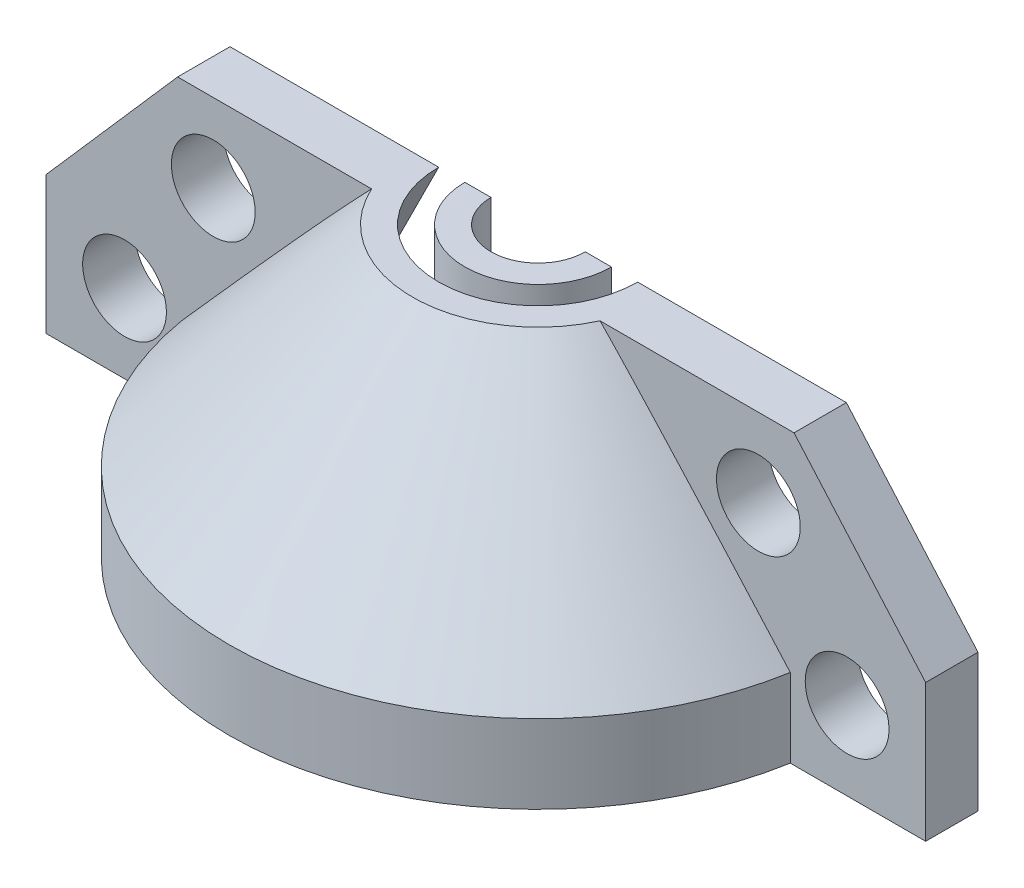
ISO-10303-21;
HEADER;
FILE_DESCRIPTION(('STEP AP214'),'2;1');
FILE_NAME('part.step','',(''),(''),'','','');
FILE_SCHEMA(('AUTOMOTIVE_DESIGN { 1 0 10303 214 1 1 1 1 }'));
ENDSEC;
DATA;
#1=APPLICATION_CONTEXT('core data for automotive mechanical design processes');
#2=APPLICATION_PROTOCOL_DEFINITION('international standard','automotive_design',2000,#1);
#3=PRODUCT_CONTEXT('',#1,'mechanical');
#4=PRODUCT('Part','Part','',(#3));
#5=PRODUCT_RELATED_PRODUCT_CATEGORY('part','',(#4));
#6=PRODUCT_DEFINITION_FORMATION('','',#4);
#7=PRODUCT_DEFINITION_CONTEXT('part definition',#1,'design');
#8=PRODUCT_DEFINITION('design','',#6,#7);
#9=PRODUCT_DEFINITION_SHAPE('','',#8);
#10=(LENGTH_UNIT() NAMED_UNIT(*) SI_UNIT(.MILLI.,.METRE.));
#11=(NAMED_UNIT(*) PLANE_ANGLE_UNIT() SI_UNIT($,.RADIAN.));
#12=(NAMED_UNIT(*) SI_UNIT($,.STERADIAN.) SOLID_ANGLE_UNIT());
#13=UNCERTAINTY_MEASURE_WITH_UNIT(LENGTH_MEASURE(1.E-05),#10,'distance_accuracy_value','');
#14=(GEOMETRIC_REPRESENTATION_CONTEXT(3) GLOBAL_UNCERTAINTY_ASSIGNED_CONTEXT((#13)) GLOBAL_UNIT_ASSIGNED_CONTEXT((#10,
#11,#12)) REPRESENTATION_CONTEXT('',''));
#15=CARTESIAN_POINT('',(0.,0.,0.));
#16=DIRECTION('',(0.,0.,1.));
#17=DIRECTION('',(1.,0.,0.));
#18=AXIS2_PLACEMENT_3D('',#15,#16,#17);
#19=CARTESIAN_POINT('',(0.,8.,0.));
#20=DIRECTION('',(0.,-1.,0.));
#21=DIRECTION('',(0.,0.,-1.));
#22=AXIS2_PLACEMENT_3D('',#19,#20,#21);
#23=CONICAL_SURFACE('',#22,4.8,0.718829999621625);
#24=CARTESIAN_POINT('',(-11.6298948995748,-0.000700000000000867,2.00000000000008));
#25=CARTESIAN_POINT('',(-11.277929965793,0.395697502474147,2.00000000000008));
#26=CARTESIAN_POINT('',(-10.9257350982388,0.791891602100132,2.00000000000008));
#27=CARTESIAN_POINT('',(-10.2205029104058,1.58384445320884,2.00000000000007));
#28=CARTESIAN_POINT('',(-9.86746528564968,1.979602933503,2.00000000000007));
#29=CARTESIAN_POINT('',(-9.15706021327963,2.77412515869561,2.00000000000006));
#30=CARTESIAN_POINT('',(-8.79968389750383,3.17288097791746,2.00000000000006));
#31=CARTESIAN_POINT('',(-8.08377041092578,3.96903655979642,2.00000000000006));
#32=CARTESIAN_POINT('',(-7.72523381345148,4.36643683738495,2.00000000000005));
#33=CARTESIAN_POINT('',(-7.14527112689657,5.00608453080283,2.00000000000005));
#34=CARTESIAN_POINT('',(-6.92445562800649,5.24888534265698,2.00000000000005));
#35=CARTESIAN_POINT('',(-6.48185524832197,5.73360128217455,2.00000000000005));
#36=CARTESIAN_POINT('',(-6.26007037001876,5.97551641211118,2.00000000000004));
#37=CARTESIAN_POINT('',(-5.81487570516459,6.45850323675924,2.00000000000004));
#38=CARTESIAN_POINT('',(-5.59146401680588,6.69957318089972,2.00000000000004));
#39=CARTESIAN_POINT('',(-5.14286133300625,7.17999204616012,2.00000000000004));
#40=CARTESIAN_POINT('',(-4.91767058421294,7.41934119735678,2.00000000000003));
#41=CARTESIAN_POINT('',(-4.46619117208702,7.8939998968516,2.00000000000003));
#42=CARTESIAN_POINT('',(-4.23991968350977,8.12932570601176,2.00000000000003));
#43=CARTESIAN_POINT('',(-3.89751897932808,8.47951770727801,2.00000000000003));
#44=CARTESIAN_POINT('',(-3.78285394206366,8.59581445793893,2.00000000000003));
#45=CARTESIAN_POINT('',(-3.55228205662546,8.82716612797727,2.00000000000002));
#46=CARTESIAN_POINT('',(-3.43637524478234,8.94222108348932,2.00000000000002));
#47=CARTESIAN_POINT('',(-3.20326572125683,9.17041817407442,2.00000000000002));
#48=CARTESIAN_POINT('',(-3.0860670447052,9.28356442243404,2.00000000000002));
#49=CARTESIAN_POINT('',(-2.84960317198888,9.50767456631936,2.00000000000002));
#50=CARTESIAN_POINT('',(-2.73033807966325,9.61863857090975,2.00000000000002));
#51=CARTESIAN_POINT('',(-2.48914480496235,9.83742872260659,2.00000000000002));
#52=CARTESIAN_POINT('',(-2.36721903299812,9.94525751899503,2.00000000000002));
#53=CARTESIAN_POINT('',(-2.11961388419542,10.1564996760355,2.00000000000001));
#54=CARTESIAN_POINT('',(-1.99393575561795,10.2599144778391,2.00000000000001));
#55=CARTESIAN_POINT('',(-1.83022649835787,10.387523291099,2.00000000000001));
#56=CARTESIAN_POINT('',(-1.79463476881164,10.414851865276,2.00000000000001));
#57=CARTESIAN_POINT('',(-1.72299938913156,10.4689177213633,2.00000000000001));
#58=CARTESIAN_POINT('',(-1.6869556997414,10.4956549513454,2.00000000000001));
#59=CARTESIAN_POINT('',(-1.6143694408097,10.5484590342689,2.00000000000001));
#60=CARTESIAN_POINT('',(-1.57782678480733,10.5745257687112,2.00000000000001));
#61=CARTESIAN_POINT('',(-1.50420085791037,10.6258822355557,2.00000000000001));
#62=CARTESIAN_POINT('',(-1.46711758227002,10.651171961131,2.00000000000001));
#63=CARTESIAN_POINT('',(-1.35520211222561,10.7255575318971,2.00000000000001));
#64=CARTESIAN_POINT('',(-1.27947724454202,10.7733367556806,2.00000000000001));
#65=CARTESIAN_POINT('',(-1.12526540004645,10.8641451205038,2.00000000000001));
#66=CARTESIAN_POINT('',(-1.04677920962335,10.9071755997127,2.00000000000001));
#67=CARTESIAN_POINT('',(-0.856345213035441,11.0018796083495,2.00000000000001));
#68=CARTESIAN_POINT('',(-0.742907806025315,11.0507232497878,2.00000000000001));
#69=CARTESIAN_POINT('',(-0.568392945044191,11.110325775848,2.));
#70=CARTESIAN_POINT('',(-0.509633290539307,11.1278915978731,2.));
#71=CARTESIAN_POINT('',(-0.390794586876089,11.1577153223655,2.));
#72=CARTESIAN_POINT('',(-0.330716537070085,11.1699771085995,2.));
#73=CARTESIAN_POINT('',(-0.2254718633146,11.1860773602293,2.));
#74=CARTESIAN_POINT('',(-0.180512084535044,11.1912797807709,2.));
#75=CARTESIAN_POINT('',(-0.0901405901280818,11.198267501285,2.));
#76=CARTESIAN_POINT('',(-0.044727771281173,11.2000384413739,2.));
#77=CARTESIAN_POINT('',(0.000700000000006584,11.1999998600001,2.));
#78=B_SPLINE_CURVE_WITH_KNOTS('',3,(#24,#25,#26,#27,#28,#29,#30,#31,#32,#33,#34,#35,#36,#37,#38,
#39,#40,#41,#42,#43,#44,#45,#46,#47,#48,#49,#50,#51,#52,#53,#54,#55,#56,#57,#58,#59,#60,#61,#62,
#63,#64,#65,#66,#67,#68,#69,#70,#71,#72,#73,#74,#75,#76,#77),.UNSPECIFIED.,.F.,.F.,(4,2,2,2,2,2,
2,2,2,2,2,2,2,2,2,2,2,2,2,2,2,2,2,2,2,2,4),(0.,1.59031291082024,3.18133149597243,
4.78772826180175,6.3934254467404,7.37800742947405,8.36258688339118,9.34860603918943,
10.3344908125966,11.313839919616,11.803789187946,12.2937241607454,12.7824158008658,
13.2710829546514,13.7593244146268,14.2474052269082,14.3820205195533,14.5166475867332,
14.6512982858161,14.7859501676302,15.0544091042225,15.3227921964053,15.6920442912289,
15.8758369692546,16.0594948402742,16.1951494298162,16.3313704840475),.UNSPECIFIED.);
#79=CARTESIAN_POINT('',(-11.6292734080853,0.,2.00000000000008));
#80=VERTEX_POINT('',#79);
#81=CARTESIAN_POINT('',(-4.36348484585427,8.,2.00000000000003));
#82=VERTEX_POINT('',#81);
#83=EDGE_CURVE('E61',#80,#82,#78,.T.);
#84=ORIENTED_EDGE('',*,*,#83,.F.);
#85=CARTESIAN_POINT('',(0.,0.,0.));
#86=DIRECTION('',(0.,1.,0.));
#87=DIRECTION('',(0.,0.,1.));
#88=AXIS2_PLACEMENT_3D('',#85,#86,#87);
#89=CIRCLE('',#88,11.8);
#90=CARTESIAN_POINT('',(11.6292734080853,0.,1.99999999999992));
#91=VERTEX_POINT('',#90);
#92=EDGE_CURVE('E284',#80,#91,#89,.T.);
#93=ORIENTED_EDGE('',*,*,#92,.T.);
#94=CARTESIAN_POINT('',(11.6298948995748,-0.000700000000000867,1.99999999999992));
#95=CARTESIAN_POINT('',(11.277929965793,0.395697502474146,1.99999999999992));
#96=CARTESIAN_POINT('',(10.9257350982388,0.791891602100133,1.99999999999992));
#97=CARTESIAN_POINT('',(10.2205029104058,1.58384445320884,1.99999999999993));
#98=CARTESIAN_POINT('',(9.86746528564971,1.97960293350301,1.99999999999993));
#99=CARTESIAN_POINT('',(9.15706021327965,2.77412515869562,1.99999999999994));
#100=CARTESIAN_POINT('',(8.79968389750385,3.17288097791747,1.99999999999994));
#101=CARTESIAN_POINT('',(8.0837704109258,3.96903655979643,1.99999999999994));
#102=CARTESIAN_POINT('',(7.7252338134515,4.36643683738496,1.99999999999995));
#103=CARTESIAN_POINT('',(7.14527112689658,5.00608453080284,1.99999999999995));
#104=CARTESIAN_POINT('',(6.9244556280065,5.24888534265699,1.99999999999995));
#105=CARTESIAN_POINT('',(6.48185524832199,5.73360128217457,1.99999999999995));
#106=CARTESIAN_POINT('',(6.26007037001878,5.97551641211119,1.99999999999996));
#107=CARTESIAN_POINT('',(5.81487570516461,6.45850323675925,1.99999999999996));
#108=CARTESIAN_POINT('',(5.5914640168059,6.69957318089973,1.99999999999996));
#109=CARTESIAN_POINT('',(5.14286133300628,7.17999204616013,1.99999999999996));
#110=CARTESIAN_POINT('',(4.91767058421296,7.41934119735678,1.99999999999997));
#111=CARTESIAN_POINT('',(4.46619117208705,7.8939998968516,1.99999999999997));
#112=CARTESIAN_POINT('',(4.2399196835098,8.12932570601177,1.99999999999997));
#113=CARTESIAN_POINT('',(3.89751897932811,8.47951770727802,1.99999999999997));
#114=CARTESIAN_POINT('',(3.78285394206368,8.59581445793893,1.99999999999997));
#115=CARTESIAN_POINT('',(3.55228205662548,8.82716612797728,1.99999999999998));
#116=CARTESIAN_POINT('',(3.43637524478236,8.94222108348932,1.99999999999998));
#117=CARTESIAN_POINT('',(3.20326572125686,9.17041817407442,1.99999999999998));
#118=CARTESIAN_POINT('',(3.08606704470523,9.28356442243404,1.99999999999998));
#119=CARTESIAN_POINT('',(2.8496031719889,9.50767456631936,1.99999999999998));
#120=CARTESIAN_POINT('',(2.73033807966328,9.61863857090975,1.99999999999998));
#121=CARTESIAN_POINT('',(2.48914480496238,9.83742872260659,1.99999999999998));
#122=CARTESIAN_POINT('',(2.36721903299814,9.94525751899503,1.99999999999998));
#123=CARTESIAN_POINT('',(2.11961388419544,10.1564996760355,1.99999999999999));
#124=CARTESIAN_POINT('',(1.99393575561798,10.2599144778391,1.99999999999999));
#125=CARTESIAN_POINT('',(1.8302264983579,10.387523291099,1.99999999999999));
#126=CARTESIAN_POINT('',(1.79463476881167,10.414851865276,1.99999999999999));
#127=CARTESIAN_POINT('',(1.72299938913159,10.4689177213633,1.99999999999999));
#128=CARTESIAN_POINT('',(1.68695569974143,10.4956549513454,1.99999999999999));
#129=CARTESIAN_POINT('',(1.61436944080973,10.5484590342689,1.99999999999999));
#130=CARTESIAN_POINT('',(1.57782678480735,10.5745257687112,1.99999999999999));
#131=CARTESIAN_POINT('',(1.5042008579104,10.6258822355557,1.99999999999999));
#132=CARTESIAN_POINT('',(1.46711758227005,10.651171961131,1.99999999999999));
#133=CARTESIAN_POINT('',(1.35520211222564,10.7255575318971,1.99999999999999));
#134=CARTESIAN_POINT('',(1.27947724454205,10.7733367556806,1.99999999999999));
#135=CARTESIAN_POINT('',(1.12526540004648,10.8641451205038,1.99999999999999));
#136=CARTESIAN_POINT('',(1.04677920962337,10.9071755997127,1.99999999999999));
#137=CARTESIAN_POINT('',(0.856345213035467,11.0018796083495,1.99999999999999));
#138=CARTESIAN_POINT('',(0.742907806025343,11.0507232497878,1.99999999999999));
#139=CARTESIAN_POINT('',(0.568392945044219,11.110325775848,2.));
#140=CARTESIAN_POINT('',(0.509633290539336,11.1278915978731,2.));
#141=CARTESIAN_POINT('',(0.390794586876119,11.1577153223655,2.));
#142=CARTESIAN_POINT('',(0.330716537070114,11.1699771085995,2.));
#143=CARTESIAN_POINT('',(0.225471863314628,11.1860773602293,2.));
#144=CARTESIAN_POINT('',(0.180512084535073,11.1912797807709,2.));
#145=CARTESIAN_POINT('',(0.0901405901281099,11.198267501285,2.));
#146=CARTESIAN_POINT('',(0.0447277712812011,11.2000384413739,2.));
#147=CARTESIAN_POINT('',(-0.00069999999997856,11.1999998600001,2.));
#148=B_SPLINE_CURVE_WITH_KNOTS('',3,(#94,#95,#96,#97,#98,#99,#100,#101,#102,#103,#104,#105,#106,
#107,#108,#109,#110,#111,#112,#113,#114,#115,#116,#117,#118,#119,#120,#121,#122,#123,#124,#125,
#126,#127,#128,#129,#130,#131,#132,#133,#134,#135,#136,#137,#138,#139,#140,#141,#142,#143,#144,
#145,#146,#147),.UNSPECIFIED.,.F.,.F.,(4,2,2,2,2,2,2,2,2,2,2,2,2,2,2,2,2,2,2,2,2,2,2,2,2,2,4),
(0.,1.59031291082024,3.18133149597243,4.78772826180176,6.39342544674042,7.37800742947407,
8.36258688339119,9.34860603918944,10.3344908125966,11.313839919616,11.803789187946,
12.2937241607454,12.7824158008658,13.2710829546514,13.7593244146268,14.2474052269082,
14.3820205195533,14.5166475867332,14.6512982858161,14.7859501676302,15.0544091042225,
15.3227921964053,15.6920442912289,15.8758369692546,16.0594948402742,16.1951494298162,
16.3313704840475),.UNSPECIFIED.);
#149=CARTESIAN_POINT('',(4.3634848458543,8.,1.99999999999997));
#150=VERTEX_POINT('',#149);
#151=EDGE_CURVE('E268',#91,#150,#148,.T.);
#152=ORIENTED_EDGE('',*,*,#151,.T.);
#153=CARTESIAN_POINT('',(0.,8.,0.));
#154=DIRECTION('',(0.,1.,0.));
#155=DIRECTION('',(0.,0.,1.));
#156=AXIS2_PLACEMENT_3D('',#153,#154,#155);
#157=CIRCLE('',#156,4.8);
#158=EDGE_CURVE('E287',#82,#150,#157,.T.);
#159=ORIENTED_EDGE('',*,*,#158,.F.);
#160=EDGE_LOOP('',(#84,#93,#152,#159));
#161=FACE_BOUND('',#160,.T.);
#162=ADVANCED_FACE('F45',(#161),#23,.T.);
#163=CARTESIAN_POINT('',(0.,0.,0.));
#164=DIRECTION('',(0.,1.,0.));
#165=DIRECTION('',(0.,0.,1.));
#166=AXIS2_PLACEMENT_3D('',#163,#164,#165);
#167=CYLINDRICAL_SURFACE('',#166,11.8);
#168=DIRECTION('',(0.,1.,0.));
#169=VECTOR('',#168,1.);
#170=CARTESIAN_POINT('',(-11.6292734080853,0.,2.00000000000008));
#171=LINE('',#170,#169);
#172=CARTESIAN_POINT('',(-11.6292734080853,-3.,2.00000000000008));
#173=VERTEX_POINT('',#172);
#174=EDGE_CURVE('E68',#173,#80,#171,.T.);
#175=ORIENTED_EDGE('',*,*,#174,.F.);
#176=CARTESIAN_POINT('',(0.,-3.,0.));
#177=DIRECTION('',(0.,1.,0.));
#178=DIRECTION('',(0.,0.,1.));
#179=AXIS2_PLACEMENT_3D('',#176,#177,#178);
#180=CIRCLE('',#179,11.8);
#181=CARTESIAN_POINT('',(11.6292734080853,-3.,1.99999999999992));
#182=VERTEX_POINT('',#181);
#183=EDGE_CURVE('E165',#173,#182,#180,.T.);
#184=ORIENTED_EDGE('',*,*,#183,.T.);
#185=DIRECTION('',(0.,1.,0.));
#186=VECTOR('',#185,1.);
#187=CARTESIAN_POINT('',(11.6292734080853,0.,1.99999999999992));
#188=LINE('',#187,#186);
#189=EDGE_CURVE('E11',#182,#91,#188,.T.);
#190=ORIENTED_EDGE('',*,*,#189,.T.);
#191=ORIENTED_EDGE('',*,*,#92,.F.);
#192=EDGE_LOOP('',(#175,#184,#190,#191));
#193=FACE_BOUND('',#192,.T.);
#194=ADVANCED_FACE('F432',(#193),#167,.T.);
#195=CARTESIAN_POINT('',(0.,-3.,0.));
#196=DIRECTION('',(0.,1.,0.));
#197=DIRECTION('',(0.,0.,1.));
#198=AXIS2_PLACEMENT_3D('',#195,#196,#197);
#199=PLANE('',#198);
#200=DIRECTION('',(1.,0.,0.));
#201=VECTOR('',#200,1.);
#202=CARTESIAN_POINT('',(0.,-3.,0.));
#203=LINE('',#202,#201);
#204=CARTESIAN_POINT('',(-16.8,-3.,1.17313772985129E-13));
#205=VERTEX_POINT('',#204);
#206=CARTESIAN_POINT('',(-1.8,-3.,0.));
#207=VERTEX_POINT('',#206);
#208=EDGE_CURVE('E290',#205,#207,#203,.T.);
#209=ORIENTED_EDGE('',*,*,#208,.T.);
#210=CARTESIAN_POINT('',(0.,-3.,0.));
#211=DIRECTION('',(0.,-1.,0.));
#212=DIRECTION('',(0.,0.,-1.));
#213=AXIS2_PLACEMENT_3D('',#210,#211,#212);
#214=CIRCLE('',#213,1.8);
#215=CARTESIAN_POINT('',(1.8,-3.,0.));
#216=VERTEX_POINT('',#215);
#217=EDGE_CURVE('E54',#216,#207,#214,.T.);
#218=ORIENTED_EDGE('',*,*,#217,.F.);
#219=DIRECTION('',(-1.,0.,0.));
#220=VECTOR('',#219,1.);
#221=CARTESIAN_POINT('',(0.,-3.,0.));
#222=LINE('',#221,#220);
#223=CARTESIAN_POINT('',(16.8,-3.,-1.17313772985129E-13));
#224=VERTEX_POINT('',#223);
#225=EDGE_CURVE('E311',#224,#216,#222,.T.);
#226=ORIENTED_EDGE('',*,*,#225,.F.);
#227=DIRECTION('',(0.,0.,-1.));
#228=VECTOR('',#227,1.);
#229=CARTESIAN_POINT('',(16.8,-3.,1.99999999999988));
#230=LINE('',#229,#228);
#231=CARTESIAN_POINT('',(16.8,-3.,1.99999999999988));
#232=VERTEX_POINT('',#231);
#233=EDGE_CURVE('E277',#232,#224,#230,.T.);
#234=ORIENTED_EDGE('',*,*,#233,.F.);
#235=DIRECTION('',(-1.,0.,0.));
#236=VECTOR('',#235,1.);
#237=CARTESIAN_POINT('',(10.8,-3.,1.99999999999992));
#238=LINE('',#237,#236);
#239=EDGE_CURVE('E390',#232,#182,#238,.T.);
#240=ORIENTED_EDGE('',*,*,#239,.T.);
#241=ORIENTED_EDGE('',*,*,#183,.F.);
#242=DIRECTION('',(-1.,0.,0.));
#243=VECTOR('',#242,1.);
#244=CARTESIAN_POINT('',(-10.8,-3.,2.00000000000008));
#245=LINE('',#244,#243);
#246=CARTESIAN_POINT('',(-16.8,-3.,2.00000000000012));
#247=VERTEX_POINT('',#246);
#248=EDGE_CURVE('E185',#173,#247,#245,.T.);
#249=ORIENTED_EDGE('',*,*,#248,.T.);
#250=DIRECTION('',(0.,0.,-1.));
#251=VECTOR('',#250,1.);
#252=CARTESIAN_POINT('',(-16.8,-3.,2.00000000000012));
#253=LINE('',#252,#251);
#254=EDGE_CURVE('E198',#247,#205,#253,.T.);
#255=ORIENTED_EDGE('',*,*,#254,.T.);
#256=EDGE_LOOP('',(#209,#218,#226,#234,#240,#241,#249,#255));
#257=FACE_BOUND('',#256,.T.);
#258=ADVANCED_FACE('F47',(#257),#199,.F.);
#259=CARTESIAN_POINT('',(0.,0.,0.));
#260=DIRECTION('',(0.,-1.,0.));
#261=DIRECTION('',(0.,0.,-1.));
#262=AXIS2_PLACEMENT_3D('',#259,#260,#261);
#263=CYLINDRICAL_SURFACE('',#262,1.8);
#264=CARTESIAN_POINT('',(0.,8.,0.));
#265=DIRECTION('',(0.,-1.,0.));
#266=DIRECTION('',(0.,0.,-1.));
#267=AXIS2_PLACEMENT_3D('',#264,#265,#266);
#268=CIRCLE('',#267,1.8);
#269=CARTESIAN_POINT('',(1.8,8.,0.));
#270=VERTEX_POINT('',#269);
#271=CARTESIAN_POINT('',(-1.8,8.,0.));
#272=VERTEX_POINT('',#271);
#273=EDGE_CURVE('E345',#270,#272,#268,.T.);
#274=ORIENTED_EDGE('',*,*,#273,.F.);
#275=DIRECTION('',(0.,-1.,0.));
#276=VECTOR('',#275,1.);
#277=CARTESIAN_POINT('',(1.8,0.,0.));
#278=LINE('',#277,#276);
#279=EDGE_CURVE('E314',#270,#216,#278,.T.);
#280=ORIENTED_EDGE('',*,*,#279,.T.);
#281=ORIENTED_EDGE('',*,*,#217,.T.);
#282=DIRECTION('',(0.,-1.,0.));
#283=VECTOR('',#282,1.);
#284=CARTESIAN_POINT('',(-1.8,0.,0.));
#285=LINE('',#284,#283);
#286=EDGE_CURVE('E293',#272,#207,#285,.T.);
#287=ORIENTED_EDGE('',*,*,#286,.F.);
#288=EDGE_LOOP('',(#274,#280,#281,#287));
#289=FACE_BOUND('',#288,.T.);
#290=ADVANCED_FACE('F352',(#289),#263,.F.);
#291=CARTESIAN_POINT('',(0.,8.,0.));
#292=DIRECTION('',(0.,-1.,0.));
#293=DIRECTION('',(0.,0.,-1.));
#294=AXIS2_PLACEMENT_3D('',#291,#292,#293);
#295=PLANE('',#294);
#296=CARTESIAN_POINT('',(0.,8.,0.));
#297=DIRECTION('',(0.,-1.,0.));
#298=DIRECTION('',(0.,0.,-1.));
#299=AXIS2_PLACEMENT_3D('',#296,#297,#298);
#300=CIRCLE('',#299,2.8);
#301=CARTESIAN_POINT('',(2.8,8.,0.));
#302=VERTEX_POINT('',#301);
#303=CARTESIAN_POINT('',(-2.8,8.,0.));
#304=VERTEX_POINT('',#303);
#305=EDGE_CURVE('E342',#302,#304,#300,.T.);
#306=ORIENTED_EDGE('',*,*,#305,.F.);
#307=DIRECTION('',(1.,0.,0.));
#308=VECTOR('',#307,1.);
#309=CARTESIAN_POINT('',(0.,8.,0.));
#310=LINE('',#309,#308);
#311=EDGE_CURVE('E318',#270,#302,#310,.T.);
#312=ORIENTED_EDGE('',*,*,#311,.F.);
#313=ORIENTED_EDGE('',*,*,#273,.T.);
#314=DIRECTION('',(-1.,0.,0.));
#315=VECTOR('',#314,1.);
#316=CARTESIAN_POINT('',(0.,8.,0.));
#317=LINE('',#316,#315);
#318=EDGE_CURVE('E296',#272,#304,#317,.T.);
#319=ORIENTED_EDGE('',*,*,#318,.T.);
#320=EDGE_LOOP('',(#306,#312,#313,#319));
#321=FACE_BOUND('',#320,.T.);
#322=ADVANCED_FACE('F360',(#321),#295,.F.);
#323=CARTESIAN_POINT('',(0.,0.,0.));
#324=DIRECTION('',(0.,-1.,0.));
#325=DIRECTION('',(0.,0.,-1.));
#326=AXIS2_PLACEMENT_3D('',#323,#324,#325);
#327=CYLINDRICAL_SURFACE('',#326,2.8);
#328=CARTESIAN_POINT('',(0.,0.,0.));
#329=DIRECTION('',(0.,-1.,0.));
#330=DIRECTION('',(0.,0.,-1.));
#331=AXIS2_PLACEMENT_3D('',#328,#329,#330);
#332=CIRCLE('',#331,2.8);
#333=CARTESIAN_POINT('',(2.8,0.,0.));
#334=VERTEX_POINT('',#333);
#335=CARTESIAN_POINT('',(-2.8,0.,0.));
#336=VERTEX_POINT('',#335);
#337=EDGE_CURVE('E339',#334,#336,#332,.T.);
#338=ORIENTED_EDGE('',*,*,#337,.F.);
#339=DIRECTION('',(0.,1.,0.));
#340=VECTOR('',#339,1.);
#341=CARTESIAN_POINT('',(2.8,0.,0.));
#342=LINE('',#341,#340);
#343=EDGE_CURVE('E322',#334,#302,#342,.T.);
#344=ORIENTED_EDGE('',*,*,#343,.T.);
#345=ORIENTED_EDGE('',*,*,#305,.T.);
#346=DIRECTION('',(0.,1.,0.));
#347=VECTOR('',#346,1.);
#348=CARTESIAN_POINT('',(-2.8,0.,0.));
#349=LINE('',#348,#347);
#350=EDGE_CURVE('E300',#336,#304,#349,.T.);
#351=ORIENTED_EDGE('',*,*,#350,.F.);
#352=EDGE_LOOP('',(#338,#344,#345,#351));
#353=FACE_BOUND('',#352,.T.);
#354=ADVANCED_FACE('F544',(#353),#327,.T.);
#355=CARTESIAN_POINT('',(0.,0.,0.));
#356=DIRECTION('',(0.,-1.,0.));
#357=DIRECTION('',(0.,0.,-1.));
#358=AXIS2_PLACEMENT_3D('',#355,#356,#357);
#359=PLANE('',#358);
#360=CARTESIAN_POINT('',(0.,0.,0.));
#361=DIRECTION('',(0.,-1.,0.));
#362=DIRECTION('',(0.,0.,-1.));
#363=AXIS2_PLACEMENT_3D('',#360,#361,#362);
#364=CIRCLE('',#363,7.8);
#365=CARTESIAN_POINT('',(7.8,0.,0.));
#366=VERTEX_POINT('',#365);
#367=CARTESIAN_POINT('',(-7.8,0.,0.));
#368=VERTEX_POINT('',#367);
#369=EDGE_CURVE('E336',#366,#368,#364,.T.);
#370=ORIENTED_EDGE('',*,*,#369,.F.);
#371=DIRECTION('',(1.,0.,0.));
#372=VECTOR('',#371,1.);
#373=CARTESIAN_POINT('',(0.,0.,0.));
#374=LINE('',#373,#372);
#375=EDGE_CURVE('E326',#334,#366,#374,.T.);
#376=ORIENTED_EDGE('',*,*,#375,.F.);
#377=ORIENTED_EDGE('',*,*,#337,.T.);
#378=DIRECTION('',(-1.,0.,0.));
#379=VECTOR('',#378,1.);
#380=CARTESIAN_POINT('',(0.,0.,0.));
#381=LINE('',#380,#379);
#382=EDGE_CURVE('E304',#336,#368,#381,.T.);
#383=ORIENTED_EDGE('',*,*,#382,.T.);
#384=EDGE_LOOP('',(#370,#376,#377,#383));
#385=FACE_BOUND('',#384,.T.);
#386=ADVANCED_FACE('F428',(#385),#359,.F.);
#387=CARTESIAN_POINT('',(0.,8.,0.));
#388=DIRECTION('',(0.,-1.,0.));
#389=DIRECTION('',(0.,0.,-1.));
#390=AXIS2_PLACEMENT_3D('',#387,#388,#389);
#391=CONICAL_SURFACE('',#390,3.8,0.463647609000806);
#392=CARTESIAN_POINT('',(0.,8.,0.));
#393=DIRECTION('',(0.,-1.,0.));
#394=DIRECTION('',(0.,0.,-1.));
#395=AXIS2_PLACEMENT_3D('',#392,#393,#394);
#396=CIRCLE('',#395,3.8);
#397=CARTESIAN_POINT('',(3.8,8.,0.));
#398=VERTEX_POINT('',#397);
#399=CARTESIAN_POINT('',(-3.8,8.,0.));
#400=VERTEX_POINT('',#399);
#401=EDGE_CURVE('E159',#398,#400,#396,.T.);
#402=ORIENTED_EDGE('',*,*,#401,.F.);
#403=DIRECTION('',(0.447213595499958,-0.894427190999916,0.));
#404=VECTOR('',#403,1.);
#405=CARTESIAN_POINT('',(6.24,3.12,0.));
#406=LINE('',#405,#404);
#407=EDGE_CURVE('E330',#398,#366,#406,.T.);
#408=ORIENTED_EDGE('',*,*,#407,.T.);
#409=ORIENTED_EDGE('',*,*,#369,.T.);
#410=DIRECTION('',(-0.447213595499958,-0.894427190999916,0.));
#411=VECTOR('',#410,1.);
#412=CARTESIAN_POINT('',(-6.24,3.12,0.));
#413=LINE('',#412,#411);
#414=EDGE_CURVE('E308',#400,#368,#413,.T.);
#415=ORIENTED_EDGE('',*,*,#414,.F.);
#416=EDGE_LOOP('',(#402,#408,#409,#415));
#417=FACE_BOUND('',#416,.T.);
#418=ADVANCED_FACE('F421',(#417),#391,.F.);
#419=CARTESIAN_POINT('',(0.,0.,0.));
#420=DIRECTION('',(0.,0.,-1.));
#421=DIRECTION('',(-1.,0.,0.));
#422=AXIS2_PLACEMENT_3D('',#419,#420,#421);
#423=PLANE('',#422);
#424=ORIENTED_EDGE('',*,*,#407,.F.);
#425=DIRECTION('',(1.,0.,0.));
#426=VECTOR('',#425,1.);
#427=CARTESIAN_POINT('',(3.8,8.,0.));
#428=LINE('',#427,#426);
#429=CARTESIAN_POINT('',(11.772609359551,8.,0.));
#430=VERTEX_POINT('',#429);
#431=EDGE_CURVE('E166',#398,#430,#428,.T.);
#432=ORIENTED_EDGE('',*,*,#431,.T.);
#433=DIRECTION('',(0.658504607868518,-0.752576694706878,0.));
#434=VECTOR('',#433,1.);
#435=CARTESIAN_POINT('',(11.772609359551,8.,0.));
#436=LINE('',#435,#434);
#437=CARTESIAN_POINT('',(16.8,2.25441069662969,-1.17313772985129E-13));
#438=VERTEX_POINT('',#437);
#439=EDGE_CURVE('E386',#430,#438,#436,.T.);
#440=ORIENTED_EDGE('',*,*,#439,.T.);
#441=DIRECTION('',(0.,-1.,0.));
#442=VECTOR('',#441,1.);
#443=CARTESIAN_POINT('',(16.8,-3.,-1.17313772985129E-13));
#444=LINE('',#443,#442);
#445=EDGE_CURVE('E370',#438,#224,#444,.T.);
#446=ORIENTED_EDGE('',*,*,#445,.T.);
#447=ORIENTED_EDGE('',*,*,#225,.T.);
#448=ORIENTED_EDGE('',*,*,#279,.F.);
#449=ORIENTED_EDGE('',*,*,#311,.T.);
#450=ORIENTED_EDGE('',*,*,#343,.F.);
#451=ORIENTED_EDGE('',*,*,#375,.T.);
#452=EDGE_LOOP('',(#424,#432,#440,#446,#447,#448,#449,#450,#451));
#453=FACE_BOUND('',#452,.T.);
#454=CARTESIAN_POINT('',(13.8,0.,0.));
#455=DIRECTION('',(0.,0.,-1.));
#456=DIRECTION('',(-1.,0.,0.));
#457=AXIS2_PLACEMENT_3D('',#454,#455,#456);
#458=CIRCLE('',#457,1.6);
#459=CARTESIAN_POINT('',(12.2,0.,0.));
#460=VERTEX_POINT('',#459);
#461=EDGE_CURVE('E229',#460,#460,#458,.T.);
#462=ORIENTED_EDGE('',*,*,#461,.F.);
#463=EDGE_LOOP('',(#462));
#464=FACE_BOUND('',#463,.T.);
#465=CARTESIAN_POINT('',(10.4113046797755,5.,0.));
#466=DIRECTION('',(0.,0.,-1.));
#467=DIRECTION('',(-1.,0.,0.));
#468=AXIS2_PLACEMENT_3D('',#465,#466,#467);
#469=CIRCLE('',#468,1.6);
#470=CARTESIAN_POINT('',(8.81130467977549,5.,0.));
#471=VERTEX_POINT('',#470);
#472=EDGE_CURVE('E401',#471,#471,#469,.T.);
#473=ORIENTED_EDGE('',*,*,#472,.F.);
#474=EDGE_LOOP('',(#473));
#475=FACE_BOUND('',#474,.T.);
#476=ADVANCED_FACE('F364',(#453,#464,#475),#423,.T.);
#477=CARTESIAN_POINT('',(0.,0.,0.));
#478=DIRECTION('',(0.,0.,1.));
#479=DIRECTION('',(1.,0.,0.));
#480=AXIS2_PLACEMENT_3D('',#477,#478,#479);
#481=PLANE('',#480);
#482=ORIENTED_EDGE('',*,*,#286,.T.);
#483=ORIENTED_EDGE('',*,*,#208,.F.);
#484=DIRECTION('',(0.,1.,0.));
#485=VECTOR('',#484,1.);
#486=CARTESIAN_POINT('',(-16.8,-3.,1.17313772985129E-13));
#487=LINE('',#486,#485);
#488=CARTESIAN_POINT('',(-16.8,2.25441069662969,1.17313772985129E-13));
#489=VERTEX_POINT('',#488);
#490=EDGE_CURVE('E183',#205,#489,#487,.T.);
#491=ORIENTED_EDGE('',*,*,#490,.T.);
#492=DIRECTION('',(0.658504607868518,0.752576694706878,0.));
#493=VECTOR('',#492,1.);
#494=CARTESIAN_POINT('',(-11.772609359551,8.,0.));
#495=LINE('',#494,#493);
#496=CARTESIAN_POINT('',(-11.772609359551,8.,0.));
#497=VERTEX_POINT('',#496);
#498=EDGE_CURVE('E172',#489,#497,#495,.T.);
#499=ORIENTED_EDGE('',*,*,#498,.T.);
#500=DIRECTION('',(-1.,0.,0.));
#501=VECTOR('',#500,1.);
#502=CARTESIAN_POINT('',(-3.8,8.,0.));
#503=LINE('',#502,#501);
#504=EDGE_CURVE('E152',#400,#497,#503,.T.);
#505=ORIENTED_EDGE('',*,*,#504,.F.);
#506=ORIENTED_EDGE('',*,*,#414,.T.);
#507=ORIENTED_EDGE('',*,*,#382,.F.);
#508=ORIENTED_EDGE('',*,*,#350,.T.);
#509=ORIENTED_EDGE('',*,*,#318,.F.);
#510=EDGE_LOOP('',(#482,#483,#491,#499,#505,#506,#507,#508,#509));
#511=FACE_BOUND('',#510,.T.);
#512=CARTESIAN_POINT('',(-10.4113046797755,5.,0.));
#513=DIRECTION('',(0.,0.,-1.));
#514=DIRECTION('',(1.,0.,0.));
#515=AXIS2_PLACEMENT_3D('',#512,#513,#514);
#516=CIRCLE('',#515,1.6);
#517=CARTESIAN_POINT('',(-8.81130467977549,5.,0.));
#518=VERTEX_POINT('',#517);
#519=EDGE_CURVE('E212',#518,#518,#516,.T.);
#520=ORIENTED_EDGE('',*,*,#519,.F.);
#521=EDGE_LOOP('',(#520));
#522=FACE_BOUND('',#521,.T.);
#523=CARTESIAN_POINT('',(-13.8,0.,0.));
#524=DIRECTION('',(0.,0.,-1.));
#525=DIRECTION('',(1.,0.,0.));
#526=AXIS2_PLACEMENT_3D('',#523,#524,#525);
#527=CIRCLE('',#526,1.6);
#528=CARTESIAN_POINT('',(-12.2,0.,0.));
#529=VERTEX_POINT('',#528);
#530=EDGE_CURVE('E204',#529,#529,#527,.T.);
#531=ORIENTED_EDGE('',*,*,#530,.F.);
#532=EDGE_LOOP('',(#531));
#533=FACE_BOUND('',#532,.T.);
#534=ADVANCED_FACE('F180',(#511,#522,#533),#481,.F.);
#535=CARTESIAN_POINT('',(-3.8,8.,0.));
#536=DIRECTION('',(0.,1.,0.));
#537=DIRECTION('',(0.,0.,1.));
#538=AXIS2_PLACEMENT_3D('',#535,#536,#537);
#539=PLANE('',#538);
#540=ORIENTED_EDGE('',*,*,#401,.T.);
#541=ORIENTED_EDGE('',*,*,#504,.T.);
#542=DIRECTION('',(0.,0.,-1.));
#543=VECTOR('',#542,1.);
#544=CARTESIAN_POINT('',(-11.772609359551,8.,2.00000000000008));
#545=LINE('',#544,#543);
#546=CARTESIAN_POINT('',(-11.772609359551,8.,2.00000000000008));
#547=VERTEX_POINT('',#546);
#548=EDGE_CURVE('E156',#547,#497,#545,.T.);
#549=ORIENTED_EDGE('',*,*,#548,.F.);
#550=DIRECTION('',(1.,0.,0.));
#551=VECTOR('',#550,1.);
#552=CARTESIAN_POINT('',(-3.79999999999999,8.,2.00000000000003));
#553=LINE('',#552,#551);
#554=EDGE_CURVE('E195',#547,#82,#553,.T.);
#555=ORIENTED_EDGE('',*,*,#554,.T.);
#556=ORIENTED_EDGE('',*,*,#158,.T.);
#557=DIRECTION('',(1.,0.,0.));
#558=VECTOR('',#557,1.);
#559=CARTESIAN_POINT('',(3.80000000000001,8.,1.99999999999997));
#560=LINE('',#559,#558);
#561=CARTESIAN_POINT('',(11.772609359551,8.,1.99999999999992));
#562=VERTEX_POINT('',#561);
#563=EDGE_CURVE('E385',#150,#562,#560,.T.);
#564=ORIENTED_EDGE('',*,*,#563,.T.);
#565=DIRECTION('',(0.,0.,-1.));
#566=VECTOR('',#565,1.);
#567=CARTESIAN_POINT('',(11.772609359551,8.,1.99999999999992));
#568=LINE('',#567,#566);
#569=EDGE_CURVE('E278',#562,#430,#568,.T.);
#570=ORIENTED_EDGE('',*,*,#569,.T.);
#571=ORIENTED_EDGE('',*,*,#431,.F.);
#572=EDGE_LOOP('',(#540,#541,#549,#555,#556,#564,#570,#571));
#573=FACE_BOUND('',#572,.T.);
#574=ADVANCED_FACE('F154',(#573),#539,.T.);
#575=CARTESIAN_POINT('',(16.8,-3.,1.99999999999988));
#576=DIRECTION('',(1.,0.,0.));
#577=DIRECTION('',(0.,0.,-1.));
#578=AXIS2_PLACEMENT_3D('',#575,#576,#577);
#579=PLANE('',#578);
#580=ORIENTED_EDGE('',*,*,#445,.F.);
#581=DIRECTION('',(0.,0.,-1.));
#582=VECTOR('',#581,1.);
#583=CARTESIAN_POINT('',(16.8,2.25441069662969,1.99999999999988));
#584=LINE('',#583,#582);
#585=CARTESIAN_POINT('',(16.8,2.25441069662969,1.99999999999988));
#586=VERTEX_POINT('',#585);
#587=EDGE_CURVE('E379',#586,#438,#584,.T.);
#588=ORIENTED_EDGE('',*,*,#587,.F.);
#589=DIRECTION('',(0.,-1.,0.));
#590=VECTOR('',#589,1.);
#591=CARTESIAN_POINT('',(16.8,-3.,1.99999999999988));
#592=LINE('',#591,#590);
#593=EDGE_CURVE('E377',#586,#232,#592,.T.);
#594=ORIENTED_EDGE('',*,*,#593,.T.);
#595=ORIENTED_EDGE('',*,*,#233,.T.);
#596=EDGE_LOOP('',(#580,#588,#594,#595));
#597=FACE_BOUND('',#596,.T.);
#598=ADVANCED_FACE('F265',(#597),#579,.T.);
#599=CARTESIAN_POINT('',(11.772609359551,8.,1.99999999999992));
#600=DIRECTION('',(0.752576694706878,0.658504607868518,0.));
#601=DIRECTION('',(-0.658504607868518,0.752576694706878,0.));
#602=AXIS2_PLACEMENT_3D('',#599,#600,#601);
#603=PLANE('',#602);
#604=ORIENTED_EDGE('',*,*,#439,.F.);
#605=ORIENTED_EDGE('',*,*,#569,.F.);
#606=DIRECTION('',(0.658504607868518,-0.752576694706878,0.));
#607=VECTOR('',#606,1.);
#608=CARTESIAN_POINT('',(11.772609359551,8.,1.99999999999992));
#609=LINE('',#608,#607);
#610=EDGE_CURVE('E395',#562,#586,#609,.T.);
#611=ORIENTED_EDGE('',*,*,#610,.T.);
#612=ORIENTED_EDGE('',*,*,#587,.T.);
#613=EDGE_LOOP('',(#604,#605,#611,#612));
#614=FACE_BOUND('',#613,.T.);
#615=ADVANCED_FACE('F263',(#614),#603,.T.);
#616=CARTESIAN_POINT('',(0.,0.,2.));
#617=DIRECTION('',(0.,0.,-1.));
#618=DIRECTION('',(-1.,0.,0.));
#619=AXIS2_PLACEMENT_3D('',#616,#617,#618);
#620=PLANE('',#619);
#621=ORIENTED_EDGE('',*,*,#151,.F.);
#622=ORIENTED_EDGE('',*,*,#189,.F.);
#623=ORIENTED_EDGE('',*,*,#239,.F.);
#624=ORIENTED_EDGE('',*,*,#593,.F.);
#625=ORIENTED_EDGE('',*,*,#610,.F.);
#626=ORIENTED_EDGE('',*,*,#563,.F.);
#627=EDGE_LOOP('',(#621,#622,#623,#624,#625,#626));
#628=FACE_BOUND('',#627,.T.);
#629=CARTESIAN_POINT('',(13.8,0.,1.9999999999999));
#630=DIRECTION('',(0.,0.,-1.));
#631=DIRECTION('',(-1.,0.,0.));
#632=AXIS2_PLACEMENT_3D('',#629,#630,#631);
#633=CIRCLE('',#632,1.6);
#634=CARTESIAN_POINT('',(12.2,0.,1.99999999999991));
#635=VERTEX_POINT('',#634);
#636=EDGE_CURVE('E230',#635,#635,#633,.T.);
#637=ORIENTED_EDGE('',*,*,#636,.T.);
#638=EDGE_LOOP('',(#637));
#639=FACE_BOUND('',#638,.T.);
#640=CARTESIAN_POINT('',(10.4113046797755,5.,1.99999999999993));
#641=DIRECTION('',(0.,0.,-1.));
#642=DIRECTION('',(-1.,0.,0.));
#643=AXIS2_PLACEMENT_3D('',#640,#641,#642);
#644=CIRCLE('',#643,1.6);
#645=CARTESIAN_POINT('',(8.81130467977551,5.,1.99999999999994));
#646=VERTEX_POINT('',#645);
#647=EDGE_CURVE('E389',#646,#646,#644,.T.);
#648=ORIENTED_EDGE('',*,*,#647,.T.);
#649=EDGE_LOOP('',(#648));
#650=FACE_BOUND('',#649,.T.);
#651=ADVANCED_FACE('F258',(#628,#639,#650),#620,.F.);
#652=CARTESIAN_POINT('',(10.4113046797755,5.,1.99999999999993));
#653=DIRECTION('',(0.,0.,-1.));
#654=DIRECTION('',(-1.,0.,0.));
#655=AXIS2_PLACEMENT_3D('',#652,#653,#654);
#656=CYLINDRICAL_SURFACE('',#655,1.6);
#657=ORIENTED_EDGE('',*,*,#647,.F.);
#658=EDGE_LOOP('',(#657));
#659=FACE_BOUND('',#658,.T.);
#660=ORIENTED_EDGE('',*,*,#472,.T.);
#661=EDGE_LOOP('',(#660));
#662=FACE_BOUND('',#661,.T.);
#663=ADVANCED_FACE('F254',(#659,#662),#656,.F.);
#664=CARTESIAN_POINT('',(13.8,0.,1.9999999999999));
#665=DIRECTION('',(0.,0.,-1.));
#666=DIRECTION('',(-1.,0.,0.));
#667=AXIS2_PLACEMENT_3D('',#664,#665,#666);
#668=CYLINDRICAL_SURFACE('',#667,1.6);
#669=ORIENTED_EDGE('',*,*,#636,.F.);
#670=EDGE_LOOP('',(#669));
#671=FACE_BOUND('',#670,.T.);
#672=ORIENTED_EDGE('',*,*,#461,.T.);
#673=EDGE_LOOP('',(#672));
#674=FACE_BOUND('',#673,.T.);
#675=ADVANCED_FACE('F251',(#671,#674),#668,.F.);
#676=CARTESIAN_POINT('',(-11.772609359551,8.,2.00000000000008));
#677=DIRECTION('',(-0.752576694706878,0.658504607868518,0.));
#678=DIRECTION('',(-0.658504607868518,-0.752576694706878,0.));
#679=AXIS2_PLACEMENT_3D('',#676,#677,#678);
#680=PLANE('',#679);
#681=ORIENTED_EDGE('',*,*,#498,.F.);
#682=DIRECTION('',(0.,0.,-1.));
#683=VECTOR('',#682,1.);
#684=CARTESIAN_POINT('',(-16.8,2.25441069662969,2.00000000000012));
#685=LINE('',#684,#683);
#686=CARTESIAN_POINT('',(-16.8,2.25441069662969,2.00000000000012));
#687=VERTEX_POINT('',#686);
#688=EDGE_CURVE('E177',#687,#489,#685,.T.);
#689=ORIENTED_EDGE('',*,*,#688,.F.);
#690=DIRECTION('',(0.658504607868518,0.752576694706878,0.));
#691=VECTOR('',#690,1.);
#692=CARTESIAN_POINT('',(-11.772609359551,8.,2.00000000000008));
#693=LINE('',#692,#691);
#694=EDGE_CURVE('E175',#687,#547,#693,.T.);
#695=ORIENTED_EDGE('',*,*,#694,.T.);
#696=ORIENTED_EDGE('',*,*,#548,.T.);
#697=EDGE_LOOP('',(#681,#689,#695,#696));
#698=FACE_BOUND('',#697,.T.);
#699=ADVANCED_FACE('F171',(#698),#680,.T.);
#700=CARTESIAN_POINT('',(-16.8,-3.,2.00000000000012));
#701=DIRECTION('',(-1.,0.,0.));
#702=DIRECTION('',(0.,0.,1.));
#703=AXIS2_PLACEMENT_3D('',#700,#701,#702);
#704=PLANE('',#703);
#705=ORIENTED_EDGE('',*,*,#490,.F.);
#706=ORIENTED_EDGE('',*,*,#254,.F.);
#707=DIRECTION('',(0.,1.,0.));
#708=VECTOR('',#707,1.);
#709=CARTESIAN_POINT('',(-16.8,-3.,2.00000000000012));
#710=LINE('',#709,#708);
#711=EDGE_CURVE('E191',#247,#687,#710,.T.);
#712=ORIENTED_EDGE('',*,*,#711,.T.);
#713=ORIENTED_EDGE('',*,*,#688,.T.);
#714=EDGE_LOOP('',(#705,#706,#712,#713));
#715=FACE_BOUND('',#714,.T.);
#716=ADVANCED_FACE('F241',(#715),#704,.T.);
#717=CARTESIAN_POINT('',(0.,0.,2.));
#718=DIRECTION('',(0.,0.,1.));
#719=DIRECTION('',(1.,0.,0.));
#720=AXIS2_PLACEMENT_3D('',#717,#718,#719);
#721=PLANE('',#720);
#722=CARTESIAN_POINT('',(-10.4113046797755,5.,2.00000000000007));
#723=DIRECTION('',(0.,0.,-1.));
#724=DIRECTION('',(1.,0.,0.));
#725=AXIS2_PLACEMENT_3D('',#722,#723,#724);
#726=CIRCLE('',#725,1.6);
#727=CARTESIAN_POINT('',(-8.81130467977548,5.,2.00000000000006));
#728=VERTEX_POINT('',#727);
#729=EDGE_CURVE('E208',#728,#728,#726,.T.);
#730=ORIENTED_EDGE('',*,*,#729,.T.);
#731=EDGE_LOOP('',(#730));
#732=FACE_BOUND('',#731,.T.);
#733=CARTESIAN_POINT('',(-13.8,0.,2.0000000000001));
#734=DIRECTION('',(0.,0.,-1.));
#735=DIRECTION('',(1.,0.,0.));
#736=AXIS2_PLACEMENT_3D('',#733,#734,#735);
#737=CIRCLE('',#736,1.6);
#738=CARTESIAN_POINT('',(-12.2,0.,2.00000000000009));
#739=VERTEX_POINT('',#738);
#740=EDGE_CURVE('E189',#739,#739,#737,.T.);
#741=ORIENTED_EDGE('',*,*,#740,.T.);
#742=EDGE_LOOP('',(#741));
#743=FACE_BOUND('',#742,.T.);
#744=ORIENTED_EDGE('',*,*,#174,.T.);
#745=ORIENTED_EDGE('',*,*,#83,.T.);
#746=ORIENTED_EDGE('',*,*,#554,.F.);
#747=ORIENTED_EDGE('',*,*,#694,.F.);
#748=ORIENTED_EDGE('',*,*,#711,.F.);
#749=ORIENTED_EDGE('',*,*,#248,.F.);
#750=EDGE_LOOP('',(#744,#745,#746,#747,#748,#749));
#751=FACE_BOUND('',#750,.T.);
#752=ADVANCED_FACE('F235',(#732,#743,#751),#721,.T.);
#753=CARTESIAN_POINT('',(-13.8,0.,2.0000000000001));
#754=DIRECTION('',(0.,0.,-1.));
#755=DIRECTION('',(-1.,0.,0.));
#756=AXIS2_PLACEMENT_3D('',#753,#754,#755);
#757=CYLINDRICAL_SURFACE('',#756,1.6);
#758=ORIENTED_EDGE('',*,*,#740,.F.);
#759=EDGE_LOOP('',(#758));
#760=FACE_BOUND('',#759,.T.);
#761=ORIENTED_EDGE('',*,*,#530,.T.);
#762=EDGE_LOOP('',(#761));
#763=FACE_BOUND('',#762,.T.);
#764=ADVANCED_FACE('F240',(#760,#763),#757,.F.);
#765=CARTESIAN_POINT('',(-10.4113046797755,5.,2.00000000000007));
#766=DIRECTION('',(0.,0.,-1.));
#767=DIRECTION('',(-1.,0.,0.));
#768=AXIS2_PLACEMENT_3D('',#765,#766,#767);
#769=CYLINDRICAL_SURFACE('',#768,1.6);
#770=ORIENTED_EDGE('',*,*,#729,.F.);
#771=EDGE_LOOP('',(#770));
#772=FACE_BOUND('',#771,.T.);
#773=ORIENTED_EDGE('',*,*,#519,.T.);
#774=EDGE_LOOP('',(#773));
#775=FACE_BOUND('',#774,.T.);
#776=ADVANCED_FACE('F246',(#772,#775),#769,.F.);
#777=CLOSED_SHELL('',(#162,#194,#258,#290,#322,#354,#386,#418,#476,#534,#574,#598,#615,#651,
#663,#675,#699,#716,#752,#764,#776));
#778=MANIFOLD_SOLID_BREP('B2',#777);
#779=ADVANCED_BREP_SHAPE_REPRESENTATION('',(#18,#778),#14);
#780=SHAPE_DEFINITION_REPRESENTATION(#9,#779);
ENDSEC;
END-ISO-10303-21;
